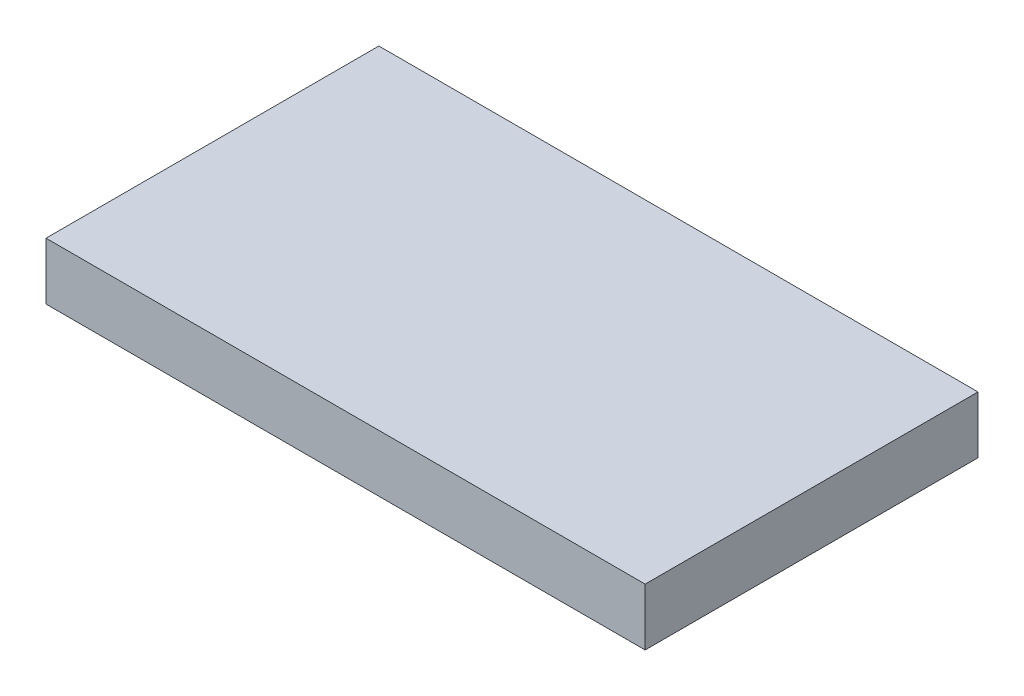
ISO-10303-21;
HEADER;
FILE_DESCRIPTION(('STEP AP214'),'2;1');
FILE_NAME('part.step','',(''),(''),'','','');
FILE_SCHEMA(('AUTOMOTIVE_DESIGN { 1 0 10303 214 1 1 1 1 }'));
ENDSEC;
DATA;
#1=APPLICATION_CONTEXT('core data for automotive mechanical design processes');
#2=APPLICATION_PROTOCOL_DEFINITION('international standard','automotive_design',2000,#1);
#3=PRODUCT_CONTEXT('',#1,'mechanical');
#4=PRODUCT('Part','Part','',(#3));
#5=PRODUCT_RELATED_PRODUCT_CATEGORY('part','',(#4));
#6=PRODUCT_DEFINITION_FORMATION('','',#4);
#7=PRODUCT_DEFINITION_CONTEXT('part definition',#1,'design');
#8=PRODUCT_DEFINITION('design','',#6,#7);
#9=PRODUCT_DEFINITION_SHAPE('','',#8);
#10=(LENGTH_UNIT() NAMED_UNIT(*) SI_UNIT(.MILLI.,.METRE.));
#11=(NAMED_UNIT(*) PLANE_ANGLE_UNIT() SI_UNIT($,.RADIAN.));
#12=(NAMED_UNIT(*) SI_UNIT($,.STERADIAN.) SOLID_ANGLE_UNIT());
#13=UNCERTAINTY_MEASURE_WITH_UNIT(LENGTH_MEASURE(1.E-05),#10,'distance_accuracy_value','');
#14=(GEOMETRIC_REPRESENTATION_CONTEXT(3) GLOBAL_UNCERTAINTY_ASSIGNED_CONTEXT((#13)) GLOBAL_UNIT_ASSIGNED_CONTEXT((#10,
#11,#12)) REPRESENTATION_CONTEXT('',''));
#15=CARTESIAN_POINT('',(0.,0.,0.));
#16=DIRECTION('',(0.,0.,1.));
#17=DIRECTION('',(1.,0.,0.));
#18=AXIS2_PLACEMENT_3D('',#15,#16,#17);
#19=CARTESIAN_POINT('',(0.,6.,0.));
#20=DIRECTION('',(-1.,0.,0.));
#21=DIRECTION('',(0.,0.,1.));
#22=AXIS2_PLACEMENT_3D('',#19,#20,#21);
#23=PLANE('',#22);
#24=DIRECTION('',(0.,0.,-1.));
#25=VECTOR('',#24,1.);
#26=CARTESIAN_POINT('',(0.,0.,0.));
#27=LINE('',#26,#25);
#28=CARTESIAN_POINT('',(0.,0.,0.));
#29=VERTEX_POINT('',#28);
#30=CARTESIAN_POINT('',(0.,0.,-35.));
#31=VERTEX_POINT('',#30);
#32=EDGE_CURVE('E99',#29,#31,#27,.T.);
#33=ORIENTED_EDGE('',*,*,#32,.F.);
#34=DIRECTION('',(0.,-1.,0.));
#35=VECTOR('',#34,1.);
#36=CARTESIAN_POINT('',(0.,6.,0.));
#37=LINE('',#36,#35);
#38=CARTESIAN_POINT('',(0.,6.,0.));
#39=VERTEX_POINT('',#38);
#40=EDGE_CURVE('E11',#39,#29,#37,.T.);
#41=ORIENTED_EDGE('',*,*,#40,.F.);
#42=DIRECTION('',(0.,0.,-1.));
#43=VECTOR('',#42,1.);
#44=CARTESIAN_POINT('',(0.,6.,0.));
#45=LINE('',#44,#43);
#46=CARTESIAN_POINT('',(0.,6.,-35.));
#47=VERTEX_POINT('',#46);
#48=EDGE_CURVE('E94',#39,#47,#45,.T.);
#49=ORIENTED_EDGE('',*,*,#48,.T.);
#50=DIRECTION('',(0.,-1.,0.));
#51=VECTOR('',#50,1.);
#52=CARTESIAN_POINT('',(0.,6.,-35.));
#53=LINE('',#52,#51);
#54=EDGE_CURVE('E37',#47,#31,#53,.T.);
#55=ORIENTED_EDGE('',*,*,#54,.T.);
#56=EDGE_LOOP('',(#33,#41,#49,#55));
#57=FACE_BOUND('',#56,.T.);
#58=ADVANCED_FACE('F34',(#57),#23,.T.);
#59=CARTESIAN_POINT('',(0.,6.,0.));
#60=DIRECTION('',(0.,0.,-1.));
#61=DIRECTION('',(-1.,0.,0.));
#62=AXIS2_PLACEMENT_3D('',#59,#60,#61);
#63=PLANE('',#62);
#64=DIRECTION('',(1.,0.,0.));
#65=VECTOR('',#64,1.);
#66=CARTESIAN_POINT('',(0.,0.,0.));
#67=LINE('',#66,#65);
#68=CARTESIAN_POINT('',(63.,0.,0.));
#69=VERTEX_POINT('',#68);
#70=EDGE_CURVE('E67',#29,#69,#67,.T.);
#71=ORIENTED_EDGE('',*,*,#70,.T.);
#72=DIRECTION('',(0.,-1.,0.));
#73=VECTOR('',#72,1.);
#74=CARTESIAN_POINT('',(63.,6.,0.));
#75=LINE('',#74,#73);
#76=CARTESIAN_POINT('',(63.,6.,0.));
#77=VERTEX_POINT('',#76);
#78=EDGE_CURVE('E43',#77,#69,#75,.T.);
#79=ORIENTED_EDGE('',*,*,#78,.F.);
#80=DIRECTION('',(1.,0.,0.));
#81=VECTOR('',#80,1.);
#82=CARTESIAN_POINT('',(0.,6.,0.));
#83=LINE('',#82,#81);
#84=EDGE_CURVE('E84',#39,#77,#83,.T.);
#85=ORIENTED_EDGE('',*,*,#84,.F.);
#86=ORIENTED_EDGE('',*,*,#40,.T.);
#87=EDGE_LOOP('',(#71,#79,#85,#86));
#88=FACE_BOUND('',#87,.T.);
#89=ADVANCED_FACE('F109',(#88),#63,.F.);
#90=CARTESIAN_POINT('',(63.,6.,0.));
#91=DIRECTION('',(-1.,0.,0.));
#92=DIRECTION('',(0.,0.,1.));
#93=AXIS2_PLACEMENT_3D('',#90,#91,#92);
#94=PLANE('',#93);
#95=DIRECTION('',(0.,0.,-1.));
#96=VECTOR('',#95,1.);
#97=CARTESIAN_POINT('',(63.,0.,0.));
#98=LINE('',#97,#96);
#99=CARTESIAN_POINT('',(63.,0.,-35.));
#100=VERTEX_POINT('',#99);
#101=EDGE_CURVE('E91',#69,#100,#98,.T.);
#102=ORIENTED_EDGE('',*,*,#101,.T.);
#103=DIRECTION('',(0.,-1.,0.));
#104=VECTOR('',#103,1.);
#105=CARTESIAN_POINT('',(63.,6.,-35.));
#106=LINE('',#105,#104);
#107=CARTESIAN_POINT('',(63.,6.,-35.));
#108=VERTEX_POINT('',#107);
#109=EDGE_CURVE('E88',#108,#100,#106,.T.);
#110=ORIENTED_EDGE('',*,*,#109,.F.);
#111=DIRECTION('',(0.,0.,-1.));
#112=VECTOR('',#111,1.);
#113=CARTESIAN_POINT('',(63.,6.,0.));
#114=LINE('',#113,#112);
#115=EDGE_CURVE('E79',#77,#108,#114,.T.);
#116=ORIENTED_EDGE('',*,*,#115,.F.);
#117=ORIENTED_EDGE('',*,*,#78,.T.);
#118=EDGE_LOOP('',(#102,#110,#116,#117));
#119=FACE_BOUND('',#118,.T.);
#120=ADVANCED_FACE('F89',(#119),#94,.F.);
#121=CARTESIAN_POINT('',(0.,6.,-35.));
#122=DIRECTION('',(0.,0.,-1.));
#123=DIRECTION('',(-1.,0.,0.));
#124=AXIS2_PLACEMENT_3D('',#121,#122,#123);
#125=PLANE('',#124);
#126=DIRECTION('',(1.,0.,0.));
#127=VECTOR('',#126,1.);
#128=CARTESIAN_POINT('',(0.,0.,-35.));
#129=LINE('',#128,#127);
#130=EDGE_CURVE('E102',#31,#100,#129,.T.);
#131=ORIENTED_EDGE('',*,*,#130,.F.);
#132=ORIENTED_EDGE('',*,*,#54,.F.);
#133=DIRECTION('',(1.,0.,0.));
#134=VECTOR('',#133,1.);
#135=CARTESIAN_POINT('',(0.,6.,-35.));
#136=LINE('',#135,#134);
#137=EDGE_CURVE('E83',#47,#108,#136,.T.);
#138=ORIENTED_EDGE('',*,*,#137,.T.);
#139=ORIENTED_EDGE('',*,*,#109,.T.);
#140=EDGE_LOOP('',(#131,#132,#138,#139));
#141=FACE_BOUND('',#140,.T.);
#142=ADVANCED_FACE('F93',(#141),#125,.T.);
#143=CARTESIAN_POINT('',(0.,6.,0.));
#144=DIRECTION('',(0.,-1.,0.));
#145=DIRECTION('',(0.,0.,-1.));
#146=AXIS2_PLACEMENT_3D('',#143,#144,#145);
#147=PLANE('',#146);
#148=ORIENTED_EDGE('',*,*,#48,.F.);
#149=ORIENTED_EDGE('',*,*,#84,.T.);
#150=ORIENTED_EDGE('',*,*,#115,.T.);
#151=ORIENTED_EDGE('',*,*,#137,.F.);
#152=EDGE_LOOP('',(#148,#149,#150,#151));
#153=FACE_BOUND('',#152,.T.);
#154=ADVANCED_FACE('F82',(#153),#147,.F.);
#155=CARTESIAN_POINT('',(0.,0.,0.));
#156=DIRECTION('',(0.,-1.,0.));
#157=DIRECTION('',(0.,0.,-1.));
#158=AXIS2_PLACEMENT_3D('',#155,#156,#157);
#159=PLANE('',#158);
#160=ORIENTED_EDGE('',*,*,#32,.T.);
#161=ORIENTED_EDGE('',*,*,#130,.T.);
#162=ORIENTED_EDGE('',*,*,#101,.F.);
#163=ORIENTED_EDGE('',*,*,#70,.F.);
#164=EDGE_LOOP('',(#160,#161,#162,#163));
#165=FACE_BOUND('',#164,.T.);
#166=ADVANCED_FACE('F107',(#165),#159,.T.);
#167=CLOSED_SHELL('',(#58,#89,#120,#142,#154,#166));
#168=MANIFOLD_SOLID_BREP('B2',#167);
#169=ADVANCED_BREP_SHAPE_REPRESENTATION('',(#18,#168),#14);
#170=SHAPE_DEFINITION_REPRESENTATION(#9,#169);
ENDSEC;
END-ISO-10303-21;
